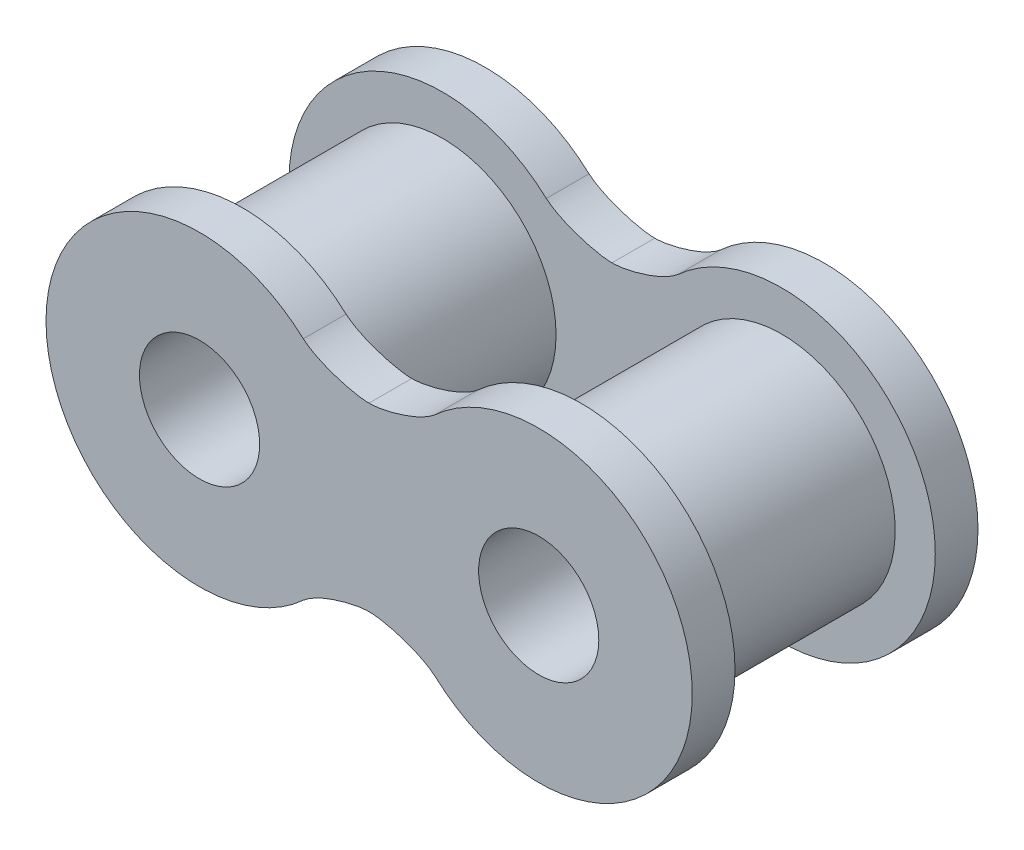
ISO-10303-21;
HEADER;
FILE_DESCRIPTION(('STEP AP214'),'2;1');
FILE_NAME('part.step','',(''),(''),'','','');
FILE_SCHEMA(('AUTOMOTIVE_DESIGN { 1 0 10303 214 1 1 1 1 }'));
ENDSEC;
DATA;
#1=APPLICATION_CONTEXT('core data for automotive mechanical design processes');
#2=APPLICATION_PROTOCOL_DEFINITION('international standard','automotive_design',2000,#1);
#3=PRODUCT_CONTEXT('',#1,'mechanical');
#4=PRODUCT('Part','Part','',(#3));
#5=PRODUCT_RELATED_PRODUCT_CATEGORY('part','',(#4));
#6=PRODUCT_DEFINITION_FORMATION('','',#4);
#7=PRODUCT_DEFINITION_CONTEXT('part definition',#1,'design');
#8=PRODUCT_DEFINITION('design','',#6,#7);
#9=PRODUCT_DEFINITION_SHAPE('','',#8);
#10=(LENGTH_UNIT() NAMED_UNIT(*) SI_UNIT(.MILLI.,.METRE.));
#11=(NAMED_UNIT(*) PLANE_ANGLE_UNIT() SI_UNIT($,.RADIAN.));
#12=(NAMED_UNIT(*) SI_UNIT($,.STERADIAN.) SOLID_ANGLE_UNIT());
#13=UNCERTAINTY_MEASURE_WITH_UNIT(LENGTH_MEASURE(1.E-05),#10,'distance_accuracy_value','');
#14=(GEOMETRIC_REPRESENTATION_CONTEXT(3) GLOBAL_UNCERTAINTY_ASSIGNED_CONTEXT((#13)) GLOBAL_UNIT_ASSIGNED_CONTEXT((#10,
#11,#12)) REPRESENTATION_CONTEXT('',''));
#15=CARTESIAN_POINT('',(0.,0.,0.));
#16=DIRECTION('',(0.,0.,1.));
#17=DIRECTION('',(1.,0.,0.));
#18=AXIS2_PLACEMENT_3D('',#15,#16,#17);
#19=CARTESIAN_POINT('',(0.,0.,3.75));
#20=DIRECTION('',(0.,0.,1.));
#21=DIRECTION('',(1.,0.,0.));
#22=AXIS2_PLACEMENT_3D('',#19,#20,#21);
#23=PLANE('',#22);
#24=CARTESIAN_POINT('',(-6.34999999999999,0.,3.75));
#25=DIRECTION('',(0.,0.,1.));
#26=DIRECTION('',(1.,0.,0.));
#27=AXIS2_PLACEMENT_3D('',#24,#25,#26);
#28=CIRCLE('',#27,5.75);
#29=CARTESIAN_POINT('',(-2.46452218888914,4.23858020796649,3.75));
#30=VERTEX_POINT('',#29);
#31=CARTESIAN_POINT('',(-2.46452218888914,-4.23858020796649,3.75));
#32=VERTEX_POINT('',#31);
#33=EDGE_CURVE('E186',#30,#32,#28,.T.);
#34=ORIENTED_EDGE('',*,*,#33,.F.);
#35=CARTESIAN_POINT('',(-2.46452218888914,4.23858020796649,3.75));
#36=CARTESIAN_POINT('',(-1.80114730329289,3.67793909032685,3.75));
#37=CARTESIAN_POINT('',(-0.37079064444816,3.34588107002075,3.75));
#38=CARTESIAN_POINT('',(0.,3.3863509377361,3.75));
#39=B_SPLINE_CURVE_WITH_KNOTS('',3,(#35,#36,#37,#38),.UNSPECIFIED.,.F.,.F.,(4,4),(0.,1.),.UNSPECIFIED.);
#40=CARTESIAN_POINT('',(0.,3.3863509377361,3.75));
#41=VERTEX_POINT('',#40);
#42=EDGE_CURVE('E181',#30,#41,#39,.T.);
#43=ORIENTED_EDGE('',*,*,#42,.T.);
#44=CARTESIAN_POINT('',(2.46452218888914,4.23858020796649,3.75));
#45=CARTESIAN_POINT('',(1.80114730329289,3.67793909032685,3.75));
#46=CARTESIAN_POINT('',(0.37079064444816,3.34588107002075,3.75));
#47=CARTESIAN_POINT('',(0.,3.3863509377361,3.75));
#48=B_SPLINE_CURVE_WITH_KNOTS('',3,(#44,#45,#46,#47),.UNSPECIFIED.,.F.,.F.,(4,4),(0.,1.),.UNSPECIFIED.);
#49=CARTESIAN_POINT('',(2.46452218888915,4.23858020796648,3.75));
#50=VERTEX_POINT('',#49);
#51=EDGE_CURVE('E414',#50,#41,#48,.T.);
#52=ORIENTED_EDGE('',*,*,#51,.F.);
#53=CARTESIAN_POINT('',(6.35,0.,3.75));
#54=DIRECTION('',(0.,0.,1.));
#55=DIRECTION('',(1.,0.,0.));
#56=AXIS2_PLACEMENT_3D('',#53,#54,#55);
#57=CIRCLE('',#56,5.75);
#58=CARTESIAN_POINT('',(2.46452218888915,-4.23858020796648,3.75));
#59=VERTEX_POINT('',#58);
#60=EDGE_CURVE('E113',#50,#59,#57,.F.);
#61=ORIENTED_EDGE('',*,*,#60,.T.);
#62=CARTESIAN_POINT('',(2.46452218888914,-4.23858020796649,3.75));
#63=CARTESIAN_POINT('',(1.80114730329289,-3.67793909032685,3.75));
#64=CARTESIAN_POINT('',(0.37079064444816,-3.34588107002075,3.75));
#65=CARTESIAN_POINT('',(0.,-3.3863509377361,3.75));
#66=B_SPLINE_CURVE_WITH_KNOTS('',3,(#62,#63,#64,#65),.UNSPECIFIED.,.F.,.F.,(4,4),(0.,1.),.UNSPECIFIED.);
#67=CARTESIAN_POINT('',(0.,-3.3863509377361,3.75));
#68=VERTEX_POINT('',#67);
#69=EDGE_CURVE('E400',#59,#68,#66,.T.);
#70=ORIENTED_EDGE('',*,*,#69,.T.);
#71=CARTESIAN_POINT('',(-2.46452218888914,-4.23858020796649,3.75));
#72=CARTESIAN_POINT('',(-1.80114730329289,-3.67793909032685,3.75));
#73=CARTESIAN_POINT('',(-0.37079064444816,-3.34588107002075,3.75));
#74=CARTESIAN_POINT('',(0.,-3.3863509377361,3.75));
#75=B_SPLINE_CURVE_WITH_KNOTS('',3,(#71,#72,#73,#74),.UNSPECIFIED.,.F.,.F.,(4,4),(0.,1.),.UNSPECIFIED.);
#76=EDGE_CURVE('E394',#32,#68,#75,.T.);
#77=ORIENTED_EDGE('',*,*,#76,.F.);
#78=EDGE_LOOP('',(#34,#43,#52,#61,#70,#77));
#79=FACE_BOUND('',#78,.T.);
#80=CARTESIAN_POINT('',(-6.34999999999999,0.,3.75));
#81=DIRECTION('',(0.,0.,1.));
#82=DIRECTION('',(1.,0.,0.));
#83=AXIS2_PLACEMENT_3D('',#80,#81,#82);
#84=CIRCLE('',#83,4.25);
#85=CARTESIAN_POINT('',(-2.09999999999999,0.,3.75));
#86=VERTEX_POINT('',#85);
#87=EDGE_CURVE('E51',#86,#86,#84,.T.);
#88=ORIENTED_EDGE('',*,*,#87,.T.);
#89=EDGE_LOOP('',(#88));
#90=FACE_BOUND('',#89,.T.);
#91=CARTESIAN_POINT('',(6.35000000000001,0.,3.75));
#92=DIRECTION('',(0.,0.,1.));
#93=DIRECTION('',(1.,0.,0.));
#94=AXIS2_PLACEMENT_3D('',#91,#92,#93);
#95=CIRCLE('',#94,4.25);
#96=CARTESIAN_POINT('',(10.6,0.,3.75));
#97=VERTEX_POINT('',#96);
#98=EDGE_CURVE('E11',#97,#97,#95,.F.);
#99=ORIENTED_EDGE('',*,*,#98,.F.);
#100=EDGE_LOOP('',(#99));
#101=FACE_BOUND('',#100,.T.);
#102=ADVANCED_FACE('F41',(#79,#90,#101),#23,.F.);
#103=CARTESIAN_POINT('',(-6.34999999999999,0.,3.75));
#104=DIRECTION('',(0.,0.,-1.));
#105=DIRECTION('',(-1.,0.,0.));
#106=AXIS2_PLACEMENT_3D('',#103,#104,#105);
#107=CYLINDRICAL_SURFACE('',#106,4.25);
#108=ORIENTED_EDGE('',*,*,#87,.F.);
#109=EDGE_LOOP('',(#108));
#110=FACE_BOUND('',#109,.T.);
#111=CARTESIAN_POINT('',(-6.34999999999999,0.,-3.75));
#112=DIRECTION('',(0.,0.,1.));
#113=DIRECTION('',(1.,0.,0.));
#114=AXIS2_PLACEMENT_3D('',#111,#112,#113);
#115=CIRCLE('',#114,4.25);
#116=CARTESIAN_POINT('',(-2.09999999999999,0.,-3.75));
#117=VERTEX_POINT('',#116);
#118=EDGE_CURVE('E182',#117,#117,#115,.T.);
#119=ORIENTED_EDGE('',*,*,#118,.T.);
#120=EDGE_LOOP('',(#119));
#121=FACE_BOUND('',#120,.T.);
#122=ADVANCED_FACE('F43',(#110,#121),#107,.T.);
#123=CARTESIAN_POINT('',(-6.34999999999999,0.,3.75));
#124=DIRECTION('',(0.,0.,-1.));
#125=DIRECTION('',(-1.,0.,0.));
#126=AXIS2_PLACEMENT_3D('',#123,#124,#125);
#127=CYLINDRICAL_SURFACE('',#126,2.25);
#128=CARTESIAN_POINT('',(-6.34999999999999,0.,5.35));
#129=DIRECTION('',(0.,0.,1.));
#130=DIRECTION('',(1.,0.,0.));
#131=AXIS2_PLACEMENT_3D('',#128,#129,#130);
#132=CIRCLE('',#131,2.25);
#133=CARTESIAN_POINT('',(-4.09999999999999,0.,5.35));
#134=VERTEX_POINT('',#133);
#135=EDGE_CURVE('E177',#134,#134,#132,.F.);
#136=ORIENTED_EDGE('',*,*,#135,.F.);
#137=EDGE_LOOP('',(#136));
#138=FACE_BOUND('',#137,.T.);
#139=CARTESIAN_POINT('',(-6.34999999999999,0.,-5.35));
#140=DIRECTION('',(0.,0.,1.));
#141=DIRECTION('',(1.,0.,0.));
#142=AXIS2_PLACEMENT_3D('',#139,#140,#141);
#143=CIRCLE('',#142,2.25);
#144=CARTESIAN_POINT('',(-4.09999999999999,0.,-5.35));
#145=VERTEX_POINT('',#144);
#146=EDGE_CURVE('E222',#145,#145,#143,.F.);
#147=ORIENTED_EDGE('',*,*,#146,.T.);
#148=EDGE_LOOP('',(#147));
#149=FACE_BOUND('',#148,.T.);
#150=ADVANCED_FACE('F356',(#138,#149),#127,.F.);
#151=CARTESIAN_POINT('',(-6.34999999999999,0.,5.35));
#152=DIRECTION('',(0.,0.,-1.));
#153=DIRECTION('',(-1.,0.,0.));
#154=AXIS2_PLACEMENT_3D('',#151,#152,#153);
#155=CYLINDRICAL_SURFACE('',#154,5.75);
#156=ORIENTED_EDGE('',*,*,#33,.T.);
#157=DIRECTION('',(0.,0.,-1.));
#158=VECTOR('',#157,1.);
#159=CARTESIAN_POINT('',(-2.46452218888914,-4.23858020796649,5.35));
#160=LINE('',#159,#158);
#161=CARTESIAN_POINT('',(-2.46452218888914,-4.23858020796649,5.35));
#162=VERTEX_POINT('',#161);
#163=EDGE_CURVE('E437',#162,#32,#160,.T.);
#164=ORIENTED_EDGE('',*,*,#163,.F.);
#165=CARTESIAN_POINT('',(-6.34999999999999,0.,5.35));
#166=DIRECTION('',(0.,0.,1.));
#167=DIRECTION('',(1.,0.,0.));
#168=AXIS2_PLACEMENT_3D('',#165,#166,#167);
#169=CIRCLE('',#168,5.75);
#170=CARTESIAN_POINT('',(-2.46452218888914,4.23858020796649,5.35));
#171=VERTEX_POINT('',#170);
#172=EDGE_CURVE('E171',#171,#162,#169,.T.);
#173=ORIENTED_EDGE('',*,*,#172,.F.);
#174=DIRECTION('',(0.,0.,-1.));
#175=VECTOR('',#174,1.);
#176=CARTESIAN_POINT('',(-2.46452218888914,4.23858020796649,5.35));
#177=LINE('',#176,#175);
#178=EDGE_CURVE('E59',#171,#30,#177,.T.);
#179=ORIENTED_EDGE('',*,*,#178,.T.);
#180=EDGE_LOOP('',(#156,#164,#173,#179));
#181=FACE_BOUND('',#180,.T.);
#182=ADVANCED_FACE('F165',(#181),#155,.T.);
#183=CARTESIAN_POINT('',(-2.46452218888914,-4.23858020796649,5.35));
#184=CARTESIAN_POINT('',(-1.80114730329289,-3.67793909032685,5.35));
#185=CARTESIAN_POINT('',(-0.37079064444816,-3.34588107002075,5.35));
#186=CARTESIAN_POINT('',(0.,-3.3863509377361,5.35));
#187=B_SPLINE_CURVE_WITH_KNOTS('',3,(#183,#184,#185,#186),.UNSPECIFIED.,.F.,.F.,(4,4),(0.,1.),.UNSPECIFIED.);
#188=DIRECTION('',(0.,0.,-1.));
#189=VECTOR('',#188,1.);
#190=SURFACE_OF_LINEAR_EXTRUSION('',#187,#189);
#191=ORIENTED_EDGE('',*,*,#76,.T.);
#192=DIRECTION('',(0.,0.,-1.));
#193=VECTOR('',#192,1.);
#194=CARTESIAN_POINT('',(0.,-3.3863509377361,5.35));
#195=LINE('',#194,#193);
#196=CARTESIAN_POINT('',(0.,-3.3863509377361,5.35));
#197=VERTEX_POINT('',#196);
#198=EDGE_CURVE('E434',#197,#68,#195,.T.);
#199=ORIENTED_EDGE('',*,*,#198,.F.);
#200=EDGE_CURVE('E94',#162,#197,#187,.T.);
#201=ORIENTED_EDGE('',*,*,#200,.F.);
#202=ORIENTED_EDGE('',*,*,#163,.T.);
#203=EDGE_LOOP('',(#191,#199,#201,#202));
#204=FACE_BOUND('',#203,.T.);
#205=ADVANCED_FACE('F161',(#204),#190,.F.);
#206=CARTESIAN_POINT('',(2.46452218888914,-4.23858020796649,5.35));
#207=CARTESIAN_POINT('',(1.80114730329289,-3.67793909032685,5.35));
#208=CARTESIAN_POINT('',(0.37079064444816,-3.34588107002075,5.35));
#209=CARTESIAN_POINT('',(0.,-3.3863509377361,5.35));
#210=B_SPLINE_CURVE_WITH_KNOTS('',3,(#206,#207,#208,#209),.UNSPECIFIED.,.F.,.F.,(4,4),(0.,1.),.UNSPECIFIED.);
#211=DIRECTION('',(0.,0.,-1.));
#212=VECTOR('',#211,1.);
#213=SURFACE_OF_LINEAR_EXTRUSION('',#210,#212);
#214=ORIENTED_EDGE('',*,*,#69,.F.);
#215=DIRECTION('',(0.,0.,-1.));
#216=VECTOR('',#215,1.);
#217=CARTESIAN_POINT('',(2.46452218888915,-4.23858020796648,5.35));
#218=LINE('',#217,#216);
#219=CARTESIAN_POINT('',(2.46452218888915,-4.23858020796648,5.35));
#220=VERTEX_POINT('',#219);
#221=EDGE_CURVE('E117',#220,#59,#218,.T.);
#222=ORIENTED_EDGE('',*,*,#221,.F.);
#223=EDGE_CURVE('E130',#220,#197,#210,.T.);
#224=ORIENTED_EDGE('',*,*,#223,.T.);
#225=ORIENTED_EDGE('',*,*,#198,.T.);
#226=EDGE_LOOP('',(#214,#222,#224,#225));
#227=FACE_BOUND('',#226,.T.);
#228=ADVANCED_FACE('F158',(#227),#213,.T.);
#229=CARTESIAN_POINT('',(6.35,0.,5.35));
#230=DIRECTION('',(0.,0.,-1.));
#231=DIRECTION('',(-1.,0.,0.));
#232=AXIS2_PLACEMENT_3D('',#229,#230,#231);
#233=CYLINDRICAL_SURFACE('',#232,5.75);
#234=ORIENTED_EDGE('',*,*,#60,.F.);
#235=DIRECTION('',(0.,0.,-1.));
#236=VECTOR('',#235,1.);
#237=CARTESIAN_POINT('',(2.46452218888915,4.23858020796648,5.35));
#238=LINE('',#237,#236);
#239=CARTESIAN_POINT('',(2.46452218888915,4.23858020796648,5.35));
#240=VERTEX_POINT('',#239);
#241=EDGE_CURVE('E107',#240,#50,#238,.T.);
#242=ORIENTED_EDGE('',*,*,#241,.F.);
#243=CARTESIAN_POINT('',(6.35,0.,5.35));
#244=DIRECTION('',(0.,0.,1.));
#245=DIRECTION('',(1.,0.,0.));
#246=AXIS2_PLACEMENT_3D('',#243,#244,#245);
#247=CIRCLE('',#246,5.75);
#248=EDGE_CURVE('E111',#240,#220,#247,.F.);
#249=ORIENTED_EDGE('',*,*,#248,.T.);
#250=ORIENTED_EDGE('',*,*,#221,.T.);
#251=EDGE_LOOP('',(#234,#242,#249,#250));
#252=FACE_BOUND('',#251,.T.);
#253=ADVANCED_FACE('F109',(#252),#233,.T.);
#254=CARTESIAN_POINT('',(2.46452218888914,4.23858020796649,5.35));
#255=CARTESIAN_POINT('',(1.80114730329289,3.67793909032685,5.35));
#256=CARTESIAN_POINT('',(0.37079064444816,3.34588107002075,5.35));
#257=CARTESIAN_POINT('',(0.,3.3863509377361,5.35));
#258=B_SPLINE_CURVE_WITH_KNOTS('',3,(#254,#255,#256,#257),.UNSPECIFIED.,.F.,.F.,(4,4),(0.,1.),.UNSPECIFIED.);
#259=DIRECTION('',(0.,0.,-1.));
#260=VECTOR('',#259,1.);
#261=SURFACE_OF_LINEAR_EXTRUSION('',#258,#260);
#262=ORIENTED_EDGE('',*,*,#51,.T.);
#263=DIRECTION('',(0.,0.,-1.));
#264=VECTOR('',#263,1.);
#265=CARTESIAN_POINT('',(0.,3.3863509377361,5.35));
#266=LINE('',#265,#264);
#267=CARTESIAN_POINT('',(0.,3.3863509377361,5.35));
#268=VERTEX_POINT('',#267);
#269=EDGE_CURVE('E81',#268,#41,#266,.T.);
#270=ORIENTED_EDGE('',*,*,#269,.F.);
#271=EDGE_CURVE('E119',#240,#268,#258,.T.);
#272=ORIENTED_EDGE('',*,*,#271,.F.);
#273=ORIENTED_EDGE('',*,*,#241,.T.);
#274=EDGE_LOOP('',(#262,#270,#272,#273));
#275=FACE_BOUND('',#274,.T.);
#276=ADVANCED_FACE('F120',(#275),#261,.F.);
#277=CARTESIAN_POINT('',(-2.46452218888914,4.23858020796649,5.35));
#278=CARTESIAN_POINT('',(-1.80114730329289,3.67793909032685,5.35));
#279=CARTESIAN_POINT('',(-0.37079064444816,3.34588107002075,5.35));
#280=CARTESIAN_POINT('',(0.,3.3863509377361,5.35));
#281=B_SPLINE_CURVE_WITH_KNOTS('',3,(#277,#278,#279,#280),.UNSPECIFIED.,.F.,.F.,(4,4),(0.,1.),.UNSPECIFIED.);
#282=DIRECTION('',(0.,0.,-1.));
#283=VECTOR('',#282,1.);
#284=SURFACE_OF_LINEAR_EXTRUSION('',#281,#283);
#285=ORIENTED_EDGE('',*,*,#42,.F.);
#286=ORIENTED_EDGE('',*,*,#178,.F.);
#287=EDGE_CURVE('E124',#171,#268,#281,.T.);
#288=ORIENTED_EDGE('',*,*,#287,.T.);
#289=ORIENTED_EDGE('',*,*,#269,.T.);
#290=EDGE_LOOP('',(#285,#286,#288,#289));
#291=FACE_BOUND('',#290,.T.);
#292=ADVANCED_FACE('F154',(#291),#284,.T.);
#293=CARTESIAN_POINT('',(6.35000000000001,0.,5.35));
#294=DIRECTION('',(0.,0.,-1.));
#295=DIRECTION('',(-1.,0.,0.));
#296=AXIS2_PLACEMENT_3D('',#293,#294,#295);
#297=CYLINDRICAL_SURFACE('',#296,2.25);
#298=CARTESIAN_POINT('',(6.35000000000001,0.,5.35));
#299=DIRECTION('',(0.,0.,1.));
#300=DIRECTION('',(1.,0.,0.));
#301=AXIS2_PLACEMENT_3D('',#298,#299,#300);
#302=CIRCLE('',#301,2.25);
#303=CARTESIAN_POINT('',(8.60000000000001,0.,5.35));
#304=VERTEX_POINT('',#303);
#305=EDGE_CURVE('E385',#304,#304,#302,.T.);
#306=ORIENTED_EDGE('',*,*,#305,.T.);
#307=EDGE_LOOP('',(#306));
#308=FACE_BOUND('',#307,.T.);
#309=CARTESIAN_POINT('',(6.35000000000001,0.,-5.35));
#310=DIRECTION('',(0.,0.,1.));
#311=DIRECTION('',(1.,0.,0.));
#312=AXIS2_PLACEMENT_3D('',#309,#310,#311);
#313=CIRCLE('',#312,2.25);
#314=CARTESIAN_POINT('',(8.60000000000001,0.,-5.35));
#315=VERTEX_POINT('',#314);
#316=EDGE_CURVE('E215',#315,#315,#313,.T.);
#317=ORIENTED_EDGE('',*,*,#316,.F.);
#318=EDGE_LOOP('',(#317));
#319=FACE_BOUND('',#318,.T.);
#320=ADVANCED_FACE('F373',(#308,#319),#297,.F.);
#321=CARTESIAN_POINT('',(0.,0.,5.35));
#322=DIRECTION('',(0.,0.,1.));
#323=DIRECTION('',(1.,0.,0.));
#324=AXIS2_PLACEMENT_3D('',#321,#322,#323);
#325=PLANE('',#324);
#326=ORIENTED_EDGE('',*,*,#135,.T.);
#327=EDGE_LOOP('',(#326));
#328=FACE_BOUND('',#327,.T.);
#329=ORIENTED_EDGE('',*,*,#172,.T.);
#330=ORIENTED_EDGE('',*,*,#200,.T.);
#331=ORIENTED_EDGE('',*,*,#223,.F.);
#332=ORIENTED_EDGE('',*,*,#248,.F.);
#333=ORIENTED_EDGE('',*,*,#271,.T.);
#334=ORIENTED_EDGE('',*,*,#287,.F.);
#335=EDGE_LOOP('',(#329,#330,#331,#332,#333,#334));
#336=FACE_BOUND('',#335,.T.);
#337=ORIENTED_EDGE('',*,*,#305,.F.);
#338=EDGE_LOOP('',(#337));
#339=FACE_BOUND('',#338,.T.);
#340=ADVANCED_FACE('F127',(#328,#336,#339),#325,.T.);
#341=CARTESIAN_POINT('',(6.35000000000001,0.,3.75));
#342=DIRECTION('',(0.,0.,-1.));
#343=DIRECTION('',(-1.,0.,0.));
#344=AXIS2_PLACEMENT_3D('',#341,#342,#343);
#345=CYLINDRICAL_SURFACE('',#344,4.25);
#346=ORIENTED_EDGE('',*,*,#98,.T.);
#347=EDGE_LOOP('',(#346));
#348=FACE_BOUND('',#347,.T.);
#349=CARTESIAN_POINT('',(6.35000000000001,0.,-3.75));
#350=DIRECTION('',(0.,0.,1.));
#351=DIRECTION('',(-1.,0.,0.));
#352=AXIS2_PLACEMENT_3D('',#349,#350,#351);
#353=CIRCLE('',#352,4.25);
#354=CARTESIAN_POINT('',(2.10000000000001,0.,-3.75));
#355=VERTEX_POINT('',#354);
#356=EDGE_CURVE('E187',#355,#355,#353,.T.);
#357=ORIENTED_EDGE('',*,*,#356,.T.);
#358=EDGE_LOOP('',(#357));
#359=FACE_BOUND('',#358,.T.);
#360=ADVANCED_FACE('F380',(#348,#359),#345,.T.);
#361=CARTESIAN_POINT('',(-6.34999999999999,0.,-5.35));
#362=DIRECTION('',(0.,0.,1.));
#363=DIRECTION('',(1.,0.,0.));
#364=AXIS2_PLACEMENT_3D('',#361,#362,#363);
#365=CYLINDRICAL_SURFACE('',#364,5.75);
#366=CARTESIAN_POINT('',(-6.34999999999999,0.,-3.75));
#367=DIRECTION('',(0.,0.,1.));
#368=DIRECTION('',(1.,0.,0.));
#369=AXIS2_PLACEMENT_3D('',#366,#367,#368);
#370=CIRCLE('',#369,5.75);
#371=CARTESIAN_POINT('',(-2.46452218888914,4.23858020796649,-3.75));
#372=VERTEX_POINT('',#371);
#373=CARTESIAN_POINT('',(-2.46452218888914,-4.23858020796649,-3.75));
#374=VERTEX_POINT('',#373);
#375=EDGE_CURVE('E254',#372,#374,#370,.T.);
#376=ORIENTED_EDGE('',*,*,#375,.F.);
#377=DIRECTION('',(0.,0.,1.));
#378=VECTOR('',#377,1.);
#379=CARTESIAN_POINT('',(-2.46452218888914,4.23858020796649,-5.35));
#380=LINE('',#379,#378);
#381=CARTESIAN_POINT('',(-2.46452218888914,4.23858020796649,-5.35));
#382=VERTEX_POINT('',#381);
#383=EDGE_CURVE('E191',#382,#372,#380,.T.);
#384=ORIENTED_EDGE('',*,*,#383,.F.);
#385=CARTESIAN_POINT('',(-6.34999999999999,0.,-5.35));
#386=DIRECTION('',(0.,0.,1.));
#387=DIRECTION('',(1.,0.,0.));
#388=AXIS2_PLACEMENT_3D('',#385,#386,#387);
#389=CIRCLE('',#388,5.75);
#390=CARTESIAN_POINT('',(-2.46452218888914,-4.23858020796649,-5.35));
#391=VERTEX_POINT('',#390);
#392=EDGE_CURVE('E344',#382,#391,#389,.T.);
#393=ORIENTED_EDGE('',*,*,#392,.T.);
#394=DIRECTION('',(0.,0.,1.));
#395=VECTOR('',#394,1.);
#396=CARTESIAN_POINT('',(-2.46452218888914,-4.23858020796649,-5.35));
#397=LINE('',#396,#395);
#398=EDGE_CURVE('E211',#391,#374,#397,.T.);
#399=ORIENTED_EDGE('',*,*,#398,.T.);
#400=EDGE_LOOP('',(#376,#384,#393,#399));
#401=FACE_BOUND('',#400,.T.);
#402=ADVANCED_FACE('F345',(#401),#365,.T.);
#403=CARTESIAN_POINT('',(-2.46452218888914,4.23858020796649,-5.35));
#404=CARTESIAN_POINT('',(-1.80114730329289,3.67793909032685,-5.35));
#405=CARTESIAN_POINT('',(-0.37079064444816,3.34588107002075,-5.35));
#406=CARTESIAN_POINT('',(0.,3.3863509377361,-5.35));
#407=B_SPLINE_CURVE_WITH_KNOTS('',3,(#403,#404,#405,#406),.UNSPECIFIED.,.F.,.F.,(4,4),(0.,1.),.UNSPECIFIED.);
#408=DIRECTION('',(0.,0.,1.));
#409=VECTOR('',#408,1.);
#410=SURFACE_OF_LINEAR_EXTRUSION('',#407,#409);
#411=CARTESIAN_POINT('',(-2.46452218888914,4.23858020796649,-3.75));
#412=CARTESIAN_POINT('',(-1.80114730329289,3.67793909032685,-3.75));
#413=CARTESIAN_POINT('',(-0.37079064444816,3.34588107002075,-3.75));
#414=CARTESIAN_POINT('',(0.,3.3863509377361,-3.75));
#415=B_SPLINE_CURVE_WITH_KNOTS('',3,(#411,#412,#413,#414),.UNSPECIFIED.,.F.,.F.,(4,4),(0.,1.),.UNSPECIFIED.);
#416=CARTESIAN_POINT('',(0.,3.3863509377361,-3.75));
#417=VERTEX_POINT('',#416);
#418=EDGE_CURVE('E245',#372,#417,#415,.T.);
#419=ORIENTED_EDGE('',*,*,#418,.T.);
#420=DIRECTION('',(0.,0.,1.));
#421=VECTOR('',#420,1.);
#422=CARTESIAN_POINT('',(0.,3.3863509377361,-5.35));
#423=LINE('',#422,#421);
#424=CARTESIAN_POINT('',(0.,3.3863509377361,-5.35));
#425=VERTEX_POINT('',#424);
#426=EDGE_CURVE('E195',#425,#417,#423,.T.);
#427=ORIENTED_EDGE('',*,*,#426,.F.);
#428=EDGE_CURVE('E311',#382,#425,#407,.T.);
#429=ORIENTED_EDGE('',*,*,#428,.F.);
#430=ORIENTED_EDGE('',*,*,#383,.T.);
#431=EDGE_LOOP('',(#419,#427,#429,#430));
#432=FACE_BOUND('',#431,.T.);
#433=ADVANCED_FACE('F300',(#432),#410,.F.);
#434=CARTESIAN_POINT('',(2.46452218888914,4.23858020796649,-5.35));
#435=CARTESIAN_POINT('',(1.80114730329289,3.67793909032685,-5.35));
#436=CARTESIAN_POINT('',(0.37079064444816,3.34588107002075,-5.35));
#437=CARTESIAN_POINT('',(0.,3.3863509377361,-5.35));
#438=B_SPLINE_CURVE_WITH_KNOTS('',3,(#434,#435,#436,#437),.UNSPECIFIED.,.F.,.F.,(4,4),(0.,1.),.UNSPECIFIED.);
#439=DIRECTION('',(0.,0.,1.));
#440=VECTOR('',#439,1.);
#441=SURFACE_OF_LINEAR_EXTRUSION('',#438,#440);
#442=CARTESIAN_POINT('',(2.46452218888914,4.23858020796649,-3.75));
#443=CARTESIAN_POINT('',(1.80114730329289,3.67793909032685,-3.75));
#444=CARTESIAN_POINT('',(0.37079064444816,3.34588107002075,-3.75));
#445=CARTESIAN_POINT('',(0.,3.3863509377361,-3.75));
#446=B_SPLINE_CURVE_WITH_KNOTS('',3,(#442,#443,#444,#445),.UNSPECIFIED.,.F.,.F.,(4,4),(0.,1.),.UNSPECIFIED.);
#447=CARTESIAN_POINT('',(2.46452218888915,4.23858020796648,-3.75));
#448=VERTEX_POINT('',#447);
#449=EDGE_CURVE('E239',#448,#417,#446,.T.);
#450=ORIENTED_EDGE('',*,*,#449,.F.);
#451=DIRECTION('',(0.,0.,1.));
#452=VECTOR('',#451,1.);
#453=CARTESIAN_POINT('',(2.46452218888915,4.23858020796648,-5.35));
#454=LINE('',#453,#452);
#455=CARTESIAN_POINT('',(2.46452218888915,4.23858020796648,-5.35));
#456=VERTEX_POINT('',#455);
#457=EDGE_CURVE('E199',#456,#448,#454,.T.);
#458=ORIENTED_EDGE('',*,*,#457,.F.);
#459=EDGE_CURVE('E304',#456,#425,#438,.T.);
#460=ORIENTED_EDGE('',*,*,#459,.T.);
#461=ORIENTED_EDGE('',*,*,#426,.T.);
#462=EDGE_LOOP('',(#450,#458,#460,#461));
#463=FACE_BOUND('',#462,.T.);
#464=ADVANCED_FACE('F295',(#463),#441,.T.);
#465=CARTESIAN_POINT('',(6.35,0.,-5.35));
#466=DIRECTION('',(0.,0.,1.));
#467=DIRECTION('',(1.,0.,0.));
#468=AXIS2_PLACEMENT_3D('',#465,#466,#467);
#469=CYLINDRICAL_SURFACE('',#468,5.75);
#470=CARTESIAN_POINT('',(6.35,0.,-3.75));
#471=DIRECTION('',(0.,0.,1.));
#472=DIRECTION('',(1.,0.,0.));
#473=AXIS2_PLACEMENT_3D('',#470,#471,#472);
#474=CIRCLE('',#473,5.75);
#475=CARTESIAN_POINT('',(2.46452218888915,-4.23858020796648,-3.75));
#476=VERTEX_POINT('',#475);
#477=EDGE_CURVE('E232',#448,#476,#474,.F.);
#478=ORIENTED_EDGE('',*,*,#477,.T.);
#479=DIRECTION('',(0.,0.,1.));
#480=VECTOR('',#479,1.);
#481=CARTESIAN_POINT('',(2.46452218888915,-4.23858020796648,-5.35));
#482=LINE('',#481,#480);
#483=CARTESIAN_POINT('',(2.46452218888915,-4.23858020796648,-5.35));
#484=VERTEX_POINT('',#483);
#485=EDGE_CURVE('E203',#484,#476,#482,.T.);
#486=ORIENTED_EDGE('',*,*,#485,.F.);
#487=CARTESIAN_POINT('',(6.35,0.,-5.35));
#488=DIRECTION('',(0.,0.,1.));
#489=DIRECTION('',(1.,0.,0.));
#490=AXIS2_PLACEMENT_3D('',#487,#488,#489);
#491=CIRCLE('',#490,5.75);
#492=EDGE_CURVE('E310',#456,#484,#491,.F.);
#493=ORIENTED_EDGE('',*,*,#492,.F.);
#494=ORIENTED_EDGE('',*,*,#457,.T.);
#495=EDGE_LOOP('',(#478,#486,#493,#494));
#496=FACE_BOUND('',#495,.T.);
#497=ADVANCED_FACE('F291',(#496),#469,.T.);
#498=CARTESIAN_POINT('',(2.46452218888914,-4.23858020796649,-5.35));
#499=CARTESIAN_POINT('',(1.80114730329289,-3.67793909032685,-5.35));
#500=CARTESIAN_POINT('',(0.37079064444816,-3.34588107002075,-5.35));
#501=CARTESIAN_POINT('',(0.,-3.3863509377361,-5.35));
#502=B_SPLINE_CURVE_WITH_KNOTS('',3,(#498,#499,#500,#501),.UNSPECIFIED.,.F.,.F.,(4,4),(0.,1.),.UNSPECIFIED.);
#503=DIRECTION('',(0.,0.,1.));
#504=VECTOR('',#503,1.);
#505=SURFACE_OF_LINEAR_EXTRUSION('',#502,#504);
#506=CARTESIAN_POINT('',(2.46452218888914,-4.23858020796649,-3.75));
#507=CARTESIAN_POINT('',(1.80114730329289,-3.67793909032685,-3.75));
#508=CARTESIAN_POINT('',(0.37079064444816,-3.34588107002075,-3.75));
#509=CARTESIAN_POINT('',(0.,-3.3863509377361,-3.75));
#510=B_SPLINE_CURVE_WITH_KNOTS('',3,(#506,#507,#508,#509),.UNSPECIFIED.,.F.,.F.,(4,4),(0.,1.),.UNSPECIFIED.);
#511=CARTESIAN_POINT('',(0.,-3.3863509377361,-3.75));
#512=VERTEX_POINT('',#511);
#513=EDGE_CURVE('E223',#476,#512,#510,.T.);
#514=ORIENTED_EDGE('',*,*,#513,.T.);
#515=DIRECTION('',(0.,0.,1.));
#516=VECTOR('',#515,1.);
#517=CARTESIAN_POINT('',(0.,-3.3863509377361,-5.35));
#518=LINE('',#517,#516);
#519=CARTESIAN_POINT('',(0.,-3.3863509377361,-5.35));
#520=VERTEX_POINT('',#519);
#521=EDGE_CURVE('E207',#520,#512,#518,.T.);
#522=ORIENTED_EDGE('',*,*,#521,.F.);
#523=EDGE_CURVE('E271',#484,#520,#502,.T.);
#524=ORIENTED_EDGE('',*,*,#523,.F.);
#525=ORIENTED_EDGE('',*,*,#485,.T.);
#526=EDGE_LOOP('',(#514,#522,#524,#525));
#527=FACE_BOUND('',#526,.T.);
#528=ADVANCED_FACE('F285',(#527),#505,.F.);
#529=CARTESIAN_POINT('',(-2.46452218888914,-4.23858020796649,-5.35));
#530=CARTESIAN_POINT('',(-1.80114730329289,-3.67793909032685,-5.35));
#531=CARTESIAN_POINT('',(-0.37079064444816,-3.34588107002075,-5.35));
#532=CARTESIAN_POINT('',(0.,-3.3863509377361,-5.35));
#533=B_SPLINE_CURVE_WITH_KNOTS('',3,(#529,#530,#531,#532),.UNSPECIFIED.,.F.,.F.,(4,4),(0.,1.),.UNSPECIFIED.);
#534=DIRECTION('',(0.,0.,1.));
#535=VECTOR('',#534,1.);
#536=SURFACE_OF_LINEAR_EXTRUSION('',#533,#535);
#537=CARTESIAN_POINT('',(-2.46452218888914,-4.23858020796649,-3.75));
#538=CARTESIAN_POINT('',(-1.80114730329289,-3.67793909032685,-3.75));
#539=CARTESIAN_POINT('',(-0.37079064444816,-3.34588107002075,-3.75));
#540=CARTESIAN_POINT('',(0.,-3.3863509377361,-3.75));
#541=B_SPLINE_CURVE_WITH_KNOTS('',3,(#537,#538,#539,#540),.UNSPECIFIED.,.F.,.F.,(4,4),(0.,1.),.UNSPECIFIED.);
#542=EDGE_CURVE('E216',#374,#512,#541,.T.);
#543=ORIENTED_EDGE('',*,*,#542,.F.);
#544=ORIENTED_EDGE('',*,*,#398,.F.);
#545=EDGE_CURVE('E264',#391,#520,#533,.T.);
#546=ORIENTED_EDGE('',*,*,#545,.T.);
#547=ORIENTED_EDGE('',*,*,#521,.T.);
#548=EDGE_LOOP('',(#543,#544,#546,#547));
#549=FACE_BOUND('',#548,.T.);
#550=ADVANCED_FACE('F280',(#549),#536,.T.);
#551=CARTESIAN_POINT('',(0.,0.,-5.35));
#552=DIRECTION('',(0.,0.,-1.));
#553=DIRECTION('',(1.,0.,0.));
#554=AXIS2_PLACEMENT_3D('',#551,#552,#553);
#555=PLANE('',#554);
#556=ORIENTED_EDGE('',*,*,#146,.F.);
#557=EDGE_LOOP('',(#556));
#558=FACE_BOUND('',#557,.T.);
#559=ORIENTED_EDGE('',*,*,#392,.F.);
#560=ORIENTED_EDGE('',*,*,#428,.T.);
#561=ORIENTED_EDGE('',*,*,#459,.F.);
#562=ORIENTED_EDGE('',*,*,#492,.T.);
#563=ORIENTED_EDGE('',*,*,#523,.T.);
#564=ORIENTED_EDGE('',*,*,#545,.F.);
#565=EDGE_LOOP('',(#559,#560,#561,#562,#563,#564));
#566=FACE_BOUND('',#565,.T.);
#567=ORIENTED_EDGE('',*,*,#316,.T.);
#568=EDGE_LOOP('',(#567));
#569=FACE_BOUND('',#568,.T.);
#570=ADVANCED_FACE('F284',(#558,#566,#569),#555,.T.);
#571=CARTESIAN_POINT('',(0.,0.,-3.75));
#572=DIRECTION('',(0.,0.,-1.));
#573=DIRECTION('',(1.,0.,0.));
#574=AXIS2_PLACEMENT_3D('',#571,#572,#573);
#575=PLANE('',#574);
#576=ORIENTED_EDGE('',*,*,#118,.F.);
#577=EDGE_LOOP('',(#576));
#578=FACE_BOUND('',#577,.T.);
#579=ORIENTED_EDGE('',*,*,#356,.F.);
#580=EDGE_LOOP('',(#579));
#581=FACE_BOUND('',#580,.T.);
#582=ORIENTED_EDGE('',*,*,#375,.T.);
#583=ORIENTED_EDGE('',*,*,#542,.T.);
#584=ORIENTED_EDGE('',*,*,#513,.F.);
#585=ORIENTED_EDGE('',*,*,#477,.F.);
#586=ORIENTED_EDGE('',*,*,#449,.T.);
#587=ORIENTED_EDGE('',*,*,#418,.F.);
#588=EDGE_LOOP('',(#582,#583,#584,#585,#586,#587));
#589=FACE_BOUND('',#588,.T.);
#590=ADVANCED_FACE('F287',(#578,#581,#589),#575,.F.);
#591=CLOSED_SHELL('',(#102,#122,#150,#182,#205,#228,#253,#276,#292,#320,#340,#360,#402,#433,
#464,#497,#528,#550,#570,#590));
#592=MANIFOLD_SOLID_BREP('B2',#591);
#593=ADVANCED_BREP_SHAPE_REPRESENTATION('',(#18,#592),#14);
#594=SHAPE_DEFINITION_REPRESENTATION(#9,#593);
ENDSEC;
END-ISO-10303-21;
